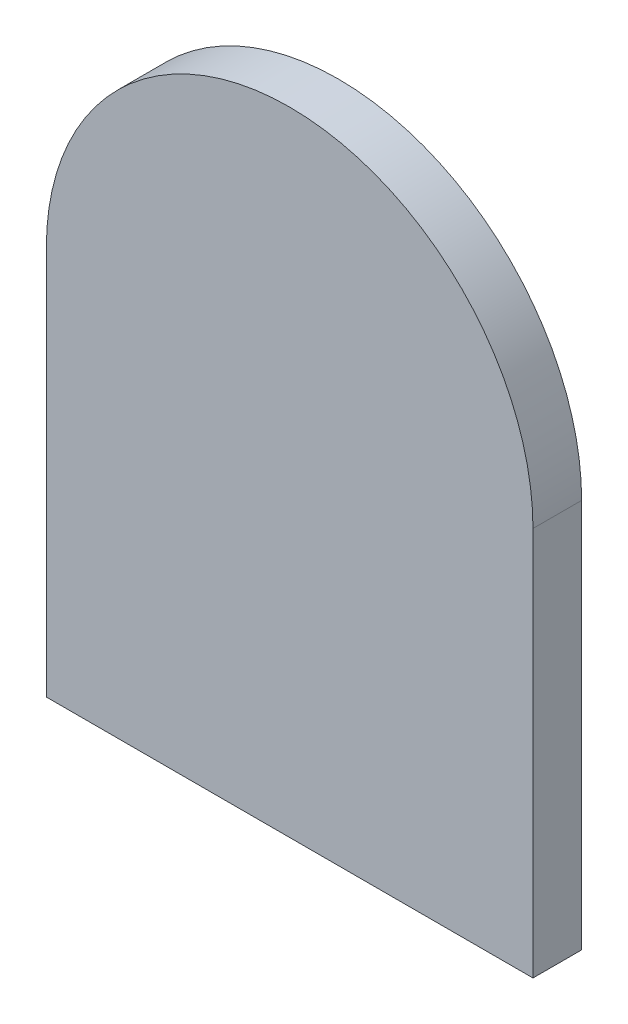
ISO-10303-21;
HEADER;
FILE_DESCRIPTION(('STEP AP214'),'2;1');
FILE_NAME('part.step','',(''),(''),'','','');
FILE_SCHEMA(('AUTOMOTIVE_DESIGN { 1 0 10303 214 1 1 1 1 }'));
ENDSEC;
DATA;
#1=APPLICATION_CONTEXT('core data for automotive mechanical design processes');
#2=APPLICATION_PROTOCOL_DEFINITION('international standard','automotive_design',2000,#1);
#3=PRODUCT_CONTEXT('',#1,'mechanical');
#4=PRODUCT('Part','Part','',(#3));
#5=PRODUCT_RELATED_PRODUCT_CATEGORY('part','',(#4));
#6=PRODUCT_DEFINITION_FORMATION('','',#4);
#7=PRODUCT_DEFINITION_CONTEXT('part definition',#1,'design');
#8=PRODUCT_DEFINITION('design','',#6,#7);
#9=PRODUCT_DEFINITION_SHAPE('','',#8);
#10=(LENGTH_UNIT() NAMED_UNIT(*) SI_UNIT(.MILLI.,.METRE.));
#11=(NAMED_UNIT(*) PLANE_ANGLE_UNIT() SI_UNIT($,.RADIAN.));
#12=(NAMED_UNIT(*) SI_UNIT($,.STERADIAN.) SOLID_ANGLE_UNIT());
#13=UNCERTAINTY_MEASURE_WITH_UNIT(LENGTH_MEASURE(1.E-05),#10,'distance_accuracy_value','');
#14=(GEOMETRIC_REPRESENTATION_CONTEXT(3) GLOBAL_UNCERTAINTY_ASSIGNED_CONTEXT((#13)) GLOBAL_UNIT_ASSIGNED_CONTEXT((#10,
#11,#12)) REPRESENTATION_CONTEXT('',''));
#15=CARTESIAN_POINT('',(0.,0.,0.));
#16=DIRECTION('',(0.,0.,1.));
#17=DIRECTION('',(1.,0.,0.));
#18=AXIS2_PLACEMENT_3D('',#15,#16,#17);
#19=CARTESIAN_POINT('',(25.,0.,5.));
#20=DIRECTION('',(1.,0.,0.));
#21=DIRECTION('',(0.,1.,0.));
#22=AXIS2_PLACEMENT_3D('',#19,#20,#21);
#23=PLANE('',#22);
#24=DIRECTION('',(0.,-1.,0.));
#25=VECTOR('',#24,1.);
#26=CARTESIAN_POINT('',(25.,0.,0.));
#27=LINE('',#26,#25);
#28=CARTESIAN_POINT('',(25.,20.,0.));
#29=VERTEX_POINT('',#28);
#30=CARTESIAN_POINT('',(25.,-20.,0.));
#31=VERTEX_POINT('',#30);
#32=EDGE_CURVE('E98',#29,#31,#27,.T.);
#33=ORIENTED_EDGE('',*,*,#32,.F.);
#34=DIRECTION('',(0.,0.,-1.));
#35=VECTOR('',#34,1.);
#36=CARTESIAN_POINT('',(25.,20.,5.));
#37=LINE('',#36,#35);
#38=CARTESIAN_POINT('',(25.,20.,5.));
#39=VERTEX_POINT('',#38);
#40=EDGE_CURVE('E11',#39,#29,#37,.T.);
#41=ORIENTED_EDGE('',*,*,#40,.F.);
#42=DIRECTION('',(0.,-1.,0.));
#43=VECTOR('',#42,1.);
#44=CARTESIAN_POINT('',(25.,0.,5.));
#45=LINE('',#44,#43);
#46=CARTESIAN_POINT('',(25.,-20.,5.));
#47=VERTEX_POINT('',#46);
#48=EDGE_CURVE('E92',#39,#47,#45,.T.);
#49=ORIENTED_EDGE('',*,*,#48,.T.);
#50=DIRECTION('',(0.,0.,-1.));
#51=VECTOR('',#50,1.);
#52=CARTESIAN_POINT('',(25.,-20.,5.));
#53=LINE('',#52,#51);
#54=EDGE_CURVE('E73',#47,#31,#53,.T.);
#55=ORIENTED_EDGE('',*,*,#54,.T.);
#56=EDGE_LOOP('',(#33,#41,#49,#55));
#57=FACE_BOUND('',#56,.T.);
#58=ADVANCED_FACE('F35',(#57),#23,.T.);
#59=CARTESIAN_POINT('',(0.,20.,5.));
#60=DIRECTION('',(0.,0.,-1.));
#61=DIRECTION('',(-1.,0.,0.));
#62=AXIS2_PLACEMENT_3D('',#59,#60,#61);
#63=CYLINDRICAL_SURFACE('',#62,25.);
#64=CARTESIAN_POINT('',(0.,20.,0.));
#65=DIRECTION('',(0.,0.,1.));
#66=DIRECTION('',(1.,0.,0.));
#67=AXIS2_PLACEMENT_3D('',#64,#65,#66);
#68=CIRCLE('',#67,25.);
#69=CARTESIAN_POINT('',(-25.,20.,0.));
#70=VERTEX_POINT('',#69);
#71=EDGE_CURVE('E86',#70,#29,#68,.F.);
#72=ORIENTED_EDGE('',*,*,#71,.F.);
#73=DIRECTION('',(0.,0.,-1.));
#74=VECTOR('',#73,1.);
#75=CARTESIAN_POINT('',(-25.,20.,5.));
#76=LINE('',#75,#74);
#77=CARTESIAN_POINT('',(-25.,20.,5.));
#78=VERTEX_POINT('',#77);
#79=EDGE_CURVE('E43',#78,#70,#76,.T.);
#80=ORIENTED_EDGE('',*,*,#79,.F.);
#81=CARTESIAN_POINT('',(0.,20.,5.));
#82=DIRECTION('',(0.,0.,1.));
#83=DIRECTION('',(1.,0.,0.));
#84=AXIS2_PLACEMENT_3D('',#81,#82,#83);
#85=CIRCLE('',#84,25.);
#86=EDGE_CURVE('E84',#78,#39,#85,.F.);
#87=ORIENTED_EDGE('',*,*,#86,.T.);
#88=ORIENTED_EDGE('',*,*,#40,.T.);
#89=EDGE_LOOP('',(#72,#80,#87,#88));
#90=FACE_BOUND('',#89,.T.);
#91=ADVANCED_FACE('F82',(#90),#63,.T.);
#92=CARTESIAN_POINT('',(-25.,0.,5.));
#93=DIRECTION('',(1.,0.,0.));
#94=DIRECTION('',(0.,1.,0.));
#95=AXIS2_PLACEMENT_3D('',#92,#93,#94);
#96=PLANE('',#95);
#97=DIRECTION('',(0.,-1.,0.));
#98=VECTOR('',#97,1.);
#99=CARTESIAN_POINT('',(-25.,0.,0.));
#100=LINE('',#99,#98);
#101=CARTESIAN_POINT('',(-25.,-20.,0.));
#102=VERTEX_POINT('',#101);
#103=EDGE_CURVE('E66',#70,#102,#100,.T.);
#104=ORIENTED_EDGE('',*,*,#103,.T.);
#105=DIRECTION('',(0.,0.,-1.));
#106=VECTOR('',#105,1.);
#107=CARTESIAN_POINT('',(-25.,-20.,5.));
#108=LINE('',#107,#106);
#109=CARTESIAN_POINT('',(-25.,-20.,5.));
#110=VERTEX_POINT('',#109);
#111=EDGE_CURVE('E87',#110,#102,#108,.T.);
#112=ORIENTED_EDGE('',*,*,#111,.F.);
#113=DIRECTION('',(0.,-1.,0.));
#114=VECTOR('',#113,1.);
#115=CARTESIAN_POINT('',(-25.,0.,5.));
#116=LINE('',#115,#114);
#117=EDGE_CURVE('E88',#78,#110,#116,.T.);
#118=ORIENTED_EDGE('',*,*,#117,.F.);
#119=ORIENTED_EDGE('',*,*,#79,.T.);
#120=EDGE_LOOP('',(#104,#112,#118,#119));
#121=FACE_BOUND('',#120,.T.);
#122=ADVANCED_FACE('F89',(#121),#96,.F.);
#123=CARTESIAN_POINT('',(0.,-20.,5.));
#124=DIRECTION('',(0.,1.,0.));
#125=DIRECTION('',(0.,0.,1.));
#126=AXIS2_PLACEMENT_3D('',#123,#124,#125);
#127=PLANE('',#126);
#128=DIRECTION('',(1.,0.,0.));
#129=VECTOR('',#128,1.);
#130=CARTESIAN_POINT('',(0.,-20.,0.));
#131=LINE('',#130,#129);
#132=EDGE_CURVE('E94',#102,#31,#131,.T.);
#133=ORIENTED_EDGE('',*,*,#132,.T.);
#134=ORIENTED_EDGE('',*,*,#54,.F.);
#135=DIRECTION('',(1.,0.,0.));
#136=VECTOR('',#135,1.);
#137=CARTESIAN_POINT('',(0.,-20.,5.));
#138=LINE('',#137,#136);
#139=EDGE_CURVE('E51',#110,#47,#138,.T.);
#140=ORIENTED_EDGE('',*,*,#139,.F.);
#141=ORIENTED_EDGE('',*,*,#111,.T.);
#142=EDGE_LOOP('',(#133,#134,#140,#141));
#143=FACE_BOUND('',#142,.T.);
#144=ADVANCED_FACE('F107',(#143),#127,.F.);
#145=CARTESIAN_POINT('',(0.,0.,5.));
#146=DIRECTION('',(0.,0.,1.));
#147=DIRECTION('',(1.,0.,0.));
#148=AXIS2_PLACEMENT_3D('',#145,#146,#147);
#149=PLANE('',#148);
#150=ORIENTED_EDGE('',*,*,#48,.F.);
#151=ORIENTED_EDGE('',*,*,#86,.F.);
#152=ORIENTED_EDGE('',*,*,#117,.T.);
#153=ORIENTED_EDGE('',*,*,#139,.T.);
#154=EDGE_LOOP('',(#150,#151,#152,#153));
#155=FACE_BOUND('',#154,.T.);
#156=ADVANCED_FACE('F91',(#155),#149,.T.);
#157=CARTESIAN_POINT('',(0.,0.,0.));
#158=DIRECTION('',(0.,0.,1.));
#159=DIRECTION('',(1.,0.,0.));
#160=AXIS2_PLACEMENT_3D('',#157,#158,#159);
#161=PLANE('',#160);
#162=ORIENTED_EDGE('',*,*,#32,.T.);
#163=ORIENTED_EDGE('',*,*,#132,.F.);
#164=ORIENTED_EDGE('',*,*,#103,.F.);
#165=ORIENTED_EDGE('',*,*,#71,.T.);
#166=EDGE_LOOP('',(#162,#163,#164,#165));
#167=FACE_BOUND('',#166,.T.);
#168=ADVANCED_FACE('F109',(#167),#161,.F.);
#169=CLOSED_SHELL('',(#58,#91,#122,#144,#156,#168));
#170=MANIFOLD_SOLID_BREP('B2',#169);
#171=ADVANCED_BREP_SHAPE_REPRESENTATION('',(#18,#170),#14);
#172=SHAPE_DEFINITION_REPRESENTATION(#9,#171);
ENDSEC;
END-ISO-10303-21;
